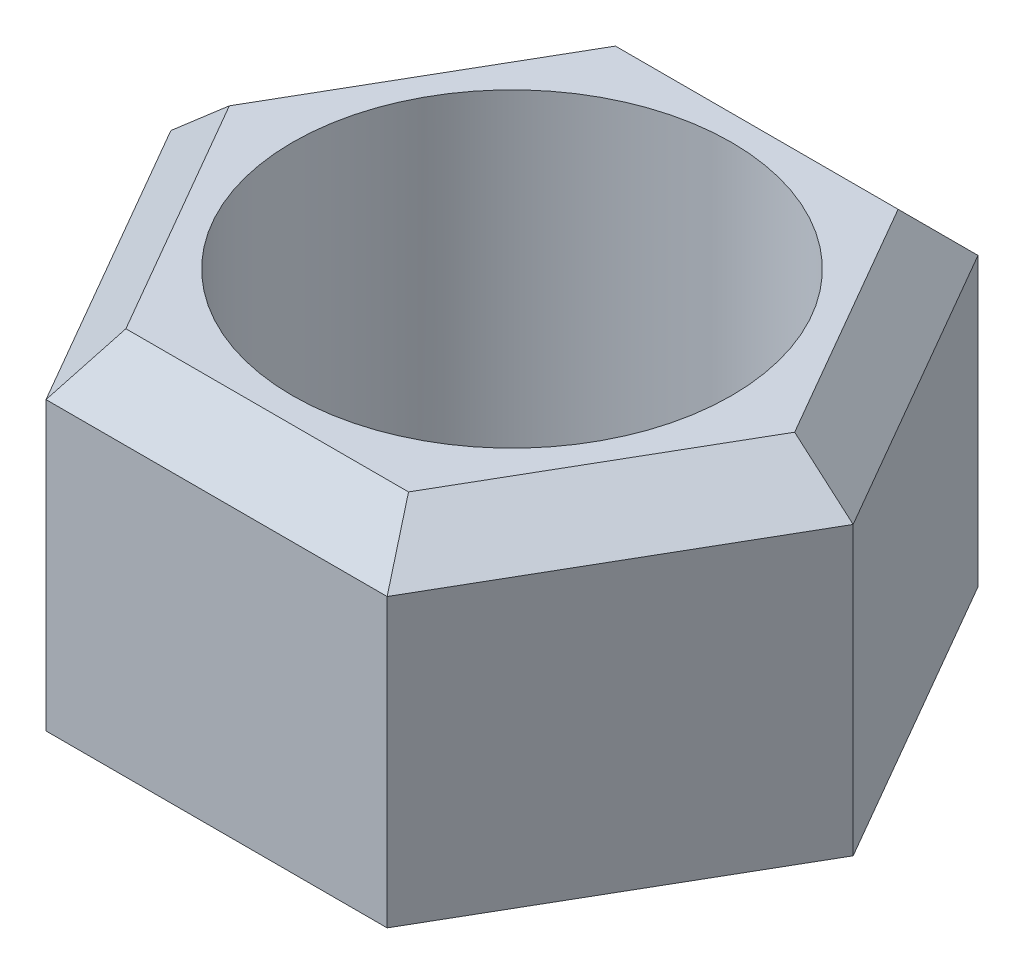
ISO-10303-21;
HEADER;
FILE_DESCRIPTION(('STEP AP214'),'2;1');
FILE_NAME('part.step','',(''),(''),'','','');
FILE_SCHEMA(('AUTOMOTIVE_DESIGN { 1 0 10303 214 1 1 1 1 }'));
ENDSEC;
DATA;
#1=APPLICATION_CONTEXT('core data for automotive mechanical design processes');
#2=APPLICATION_PROTOCOL_DEFINITION('international standard','automotive_design',2000,#1);
#3=PRODUCT_CONTEXT('',#1,'mechanical');
#4=PRODUCT('Part','Part','',(#3));
#5=PRODUCT_RELATED_PRODUCT_CATEGORY('part','',(#4));
#6=PRODUCT_DEFINITION_FORMATION('','',#4);
#7=PRODUCT_DEFINITION_CONTEXT('part definition',#1,'design');
#8=PRODUCT_DEFINITION('design','',#6,#7);
#9=PRODUCT_DEFINITION_SHAPE('','',#8);
#10=(LENGTH_UNIT() NAMED_UNIT(*) SI_UNIT(.MILLI.,.METRE.));
#11=(NAMED_UNIT(*) PLANE_ANGLE_UNIT() SI_UNIT($,.RADIAN.));
#12=(NAMED_UNIT(*) SI_UNIT($,.STERADIAN.) SOLID_ANGLE_UNIT());
#13=UNCERTAINTY_MEASURE_WITH_UNIT(LENGTH_MEASURE(1.E-05),#10,'distance_accuracy_value','');
#14=(GEOMETRIC_REPRESENTATION_CONTEXT(3) GLOBAL_UNCERTAINTY_ASSIGNED_CONTEXT((#13)) GLOBAL_UNIT_ASSIGNED_CONTEXT((#10,
#11,#12)) REPRESENTATION_CONTEXT('',''));
#15=CARTESIAN_POINT('',(0.,0.,0.));
#16=DIRECTION('',(0.,0.,1.));
#17=DIRECTION('',(1.,0.,0.));
#18=AXIS2_PLACEMENT_3D('',#15,#16,#17);
#19=CARTESIAN_POINT('',(0.202072594216369,0.2,0.));
#20=DIRECTION('',(-0.866025403784438,0.,0.5));
#21=DIRECTION('',(0.5,0.,0.866025403784439));
#22=AXIS2_PLACEMENT_3D('',#19,#20,#21);
#23=PLANE('',#22);
#24=DIRECTION('',(0.,-1.,0.));
#25=VECTOR('',#24,1.);
#26=CARTESIAN_POINT('',(0.101036297108184,0.2,-0.175));
#27=LINE('',#26,#25);
#28=CARTESIAN_POINT('',(0.101036297108184,0.17,-0.175));
#29=VERTEX_POINT('',#28);
#30=CARTESIAN_POINT('',(0.101036297108184,0.,-0.175));
#31=VERTEX_POINT('',#30);
#32=EDGE_CURVE('E110',#29,#31,#27,.T.);
#33=ORIENTED_EDGE('',*,*,#32,.F.);
#34=DIRECTION('',(0.5,0.,0.866025403784439));
#35=VECTOR('',#34,1.);
#36=CARTESIAN_POINT('',(0.202072594216369,0.17,0.));
#37=LINE('',#36,#35);
#38=CARTESIAN_POINT('',(0.202072594216369,0.17,0.));
#39=VERTEX_POINT('',#38);
#40=EDGE_CURVE('E11',#29,#39,#37,.T.);
#41=ORIENTED_EDGE('',*,*,#40,.T.);
#42=DIRECTION('',(0.,-1.,0.));
#43=VECTOR('',#42,1.);
#44=CARTESIAN_POINT('',(0.202072594216369,0.2,0.));
#45=LINE('',#44,#43);
#46=CARTESIAN_POINT('',(0.202072594216369,0.,0.));
#47=VERTEX_POINT('',#46);
#48=EDGE_CURVE('E131',#39,#47,#45,.T.);
#49=ORIENTED_EDGE('',*,*,#48,.T.);
#50=DIRECTION('',(-0.5,0.,-0.866025403784438));
#51=VECTOR('',#50,1.);
#52=CARTESIAN_POINT('',(0.202072594216369,0.,0.));
#53=LINE('',#52,#51);
#54=EDGE_CURVE('E125',#47,#31,#53,.T.);
#55=ORIENTED_EDGE('',*,*,#54,.T.);
#56=EDGE_LOOP('',(#33,#41,#49,#55));
#57=FACE_BOUND('',#56,.T.);
#58=ADVANCED_FACE('F39',(#57),#23,.F.);
#59=CARTESIAN_POINT('',(0.101036297108184,0.2,-0.175));
#60=DIRECTION('',(0.,0.,1.));
#61=DIRECTION('',(1.,0.,0.));
#62=AXIS2_PLACEMENT_3D('',#59,#60,#61);
#63=PLANE('',#62);
#64=DIRECTION('',(0.,-1.,0.));
#65=VECTOR('',#64,1.);
#66=CARTESIAN_POINT('',(-0.101036297108184,0.2,-0.175));
#67=LINE('',#66,#65);
#68=CARTESIAN_POINT('',(-0.101036297108184,0.17,-0.175));
#69=VERTEX_POINT('',#68);
#70=CARTESIAN_POINT('',(-0.101036297108184,0.,-0.175));
#71=VERTEX_POINT('',#70);
#72=EDGE_CURVE('E119',#69,#71,#67,.T.);
#73=ORIENTED_EDGE('',*,*,#72,.F.);
#74=DIRECTION('',(1.,0.,0.));
#75=VECTOR('',#74,1.);
#76=CARTESIAN_POINT('',(0.101036297108184,0.17,-0.175));
#77=LINE('',#76,#75);
#78=EDGE_CURVE('E49',#69,#29,#77,.T.);
#79=ORIENTED_EDGE('',*,*,#78,.T.);
#80=ORIENTED_EDGE('',*,*,#32,.T.);
#81=DIRECTION('',(-1.,0.,0.));
#82=VECTOR('',#81,1.);
#83=CARTESIAN_POINT('',(0.101036297108184,0.,-0.175));
#84=LINE('',#83,#82);
#85=EDGE_CURVE('E113',#31,#71,#84,.T.);
#86=ORIENTED_EDGE('',*,*,#85,.T.);
#87=EDGE_LOOP('',(#73,#79,#80,#86));
#88=FACE_BOUND('',#87,.T.);
#89=ADVANCED_FACE('F112',(#88),#63,.F.);
#90=CARTESIAN_POINT('',(-0.101036297108184,0.2,-0.175));
#91=DIRECTION('',(0.866025403784439,0.,0.5));
#92=DIRECTION('',(0.5,0.,-0.866025403784439));
#93=AXIS2_PLACEMENT_3D('',#90,#91,#92);
#94=PLANE('',#93);
#95=DIRECTION('',(0.,-1.,0.));
#96=VECTOR('',#95,1.);
#97=CARTESIAN_POINT('',(-0.202072594216369,0.2,0.));
#98=LINE('',#97,#96);
#99=CARTESIAN_POINT('',(-0.202072594216369,0.17,0.));
#100=VERTEX_POINT('',#99);
#101=CARTESIAN_POINT('',(-0.202072594216369,0.,0.));
#102=VERTEX_POINT('',#101);
#103=EDGE_CURVE('E154',#100,#102,#98,.T.);
#104=ORIENTED_EDGE('',*,*,#103,.F.);
#105=DIRECTION('',(0.5,0.,-0.866025403784439));
#106=VECTOR('',#105,1.);
#107=CARTESIAN_POINT('',(-0.101036297108184,0.17,-0.175));
#108=LINE('',#107,#106);
#109=EDGE_CURVE('E64',#100,#69,#108,.T.);
#110=ORIENTED_EDGE('',*,*,#109,.T.);
#111=ORIENTED_EDGE('',*,*,#72,.T.);
#112=DIRECTION('',(-0.5,0.,0.866025403784439));
#113=VECTOR('',#112,1.);
#114=CARTESIAN_POINT('',(-0.101036297108184,0.,-0.175));
#115=LINE('',#114,#113);
#116=EDGE_CURVE('E128',#71,#102,#115,.T.);
#117=ORIENTED_EDGE('',*,*,#116,.T.);
#118=EDGE_LOOP('',(#104,#110,#111,#117));
#119=FACE_BOUND('',#118,.T.);
#120=ADVANCED_FACE('F222',(#119),#94,.F.);
#121=CARTESIAN_POINT('',(-0.202072594216369,0.2,0.));
#122=DIRECTION('',(0.866025403784438,0.,-0.5));
#123=DIRECTION('',(-0.5,0.,-0.866025403784439));
#124=AXIS2_PLACEMENT_3D('',#121,#122,#123);
#125=PLANE('',#124);
#126=DIRECTION('',(0.,-1.,0.));
#127=VECTOR('',#126,1.);
#128=CARTESIAN_POINT('',(-0.101036297108184,0.2,0.175));
#129=LINE('',#128,#127);
#130=CARTESIAN_POINT('',(-0.101036297108184,0.17,0.175));
#131=VERTEX_POINT('',#130);
#132=CARTESIAN_POINT('',(-0.101036297108184,0.,0.175));
#133=VERTEX_POINT('',#132);
#134=EDGE_CURVE('E152',#131,#133,#129,.T.);
#135=ORIENTED_EDGE('',*,*,#134,.F.);
#136=DIRECTION('',(-0.5,0.,-0.866025403784439));
#137=VECTOR('',#136,1.);
#138=CARTESIAN_POINT('',(-0.202072594216369,0.17,0.));
#139=LINE('',#138,#137);
#140=EDGE_CURVE('E174',#131,#100,#139,.T.);
#141=ORIENTED_EDGE('',*,*,#140,.T.);
#142=ORIENTED_EDGE('',*,*,#103,.T.);
#143=DIRECTION('',(0.5,0.,0.866025403784439));
#144=VECTOR('',#143,1.);
#145=CARTESIAN_POINT('',(-0.202072594216369,0.,0.));
#146=LINE('',#145,#144);
#147=EDGE_CURVE('E141',#102,#133,#146,.T.);
#148=ORIENTED_EDGE('',*,*,#147,.T.);
#149=EDGE_LOOP('',(#135,#141,#142,#148));
#150=FACE_BOUND('',#149,.T.);
#151=ADVANCED_FACE('F279',(#150),#125,.F.);
#152=CARTESIAN_POINT('',(-0.101036297108184,0.2,0.175));
#153=DIRECTION('',(0.,0.,-1.));
#154=DIRECTION('',(-1.,0.,0.));
#155=AXIS2_PLACEMENT_3D('',#152,#153,#154);
#156=PLANE('',#155);
#157=DIRECTION('',(0.,-1.,0.));
#158=VECTOR('',#157,1.);
#159=CARTESIAN_POINT('',(0.101036297108185,0.2,0.175));
#160=LINE('',#159,#158);
#161=CARTESIAN_POINT('',(0.101036297108185,0.17,0.175));
#162=VERTEX_POINT('',#161);
#163=CARTESIAN_POINT('',(0.101036297108185,0.,0.175));
#164=VERTEX_POINT('',#163);
#165=EDGE_CURVE('E150',#162,#164,#160,.T.);
#166=ORIENTED_EDGE('',*,*,#165,.F.);
#167=DIRECTION('',(-1.,0.,0.));
#168=VECTOR('',#167,1.);
#169=CARTESIAN_POINT('',(-0.101036297108184,0.17,0.175));
#170=LINE('',#169,#168);
#171=EDGE_CURVE('E172',#162,#131,#170,.T.);
#172=ORIENTED_EDGE('',*,*,#171,.T.);
#173=ORIENTED_EDGE('',*,*,#134,.T.);
#174=DIRECTION('',(1.,0.,0.));
#175=VECTOR('',#174,1.);
#176=CARTESIAN_POINT('',(-0.101036297108184,0.,0.175));
#177=LINE('',#176,#175);
#178=EDGE_CURVE('E144',#133,#164,#177,.T.);
#179=ORIENTED_EDGE('',*,*,#178,.T.);
#180=EDGE_LOOP('',(#166,#172,#173,#179));
#181=FACE_BOUND('',#180,.T.);
#182=ADVANCED_FACE('F277',(#181),#156,.F.);
#183=CARTESIAN_POINT('',(0.101036297108185,0.2,0.175));
#184=DIRECTION('',(-0.866025403784439,0.,-0.5));
#185=DIRECTION('',(-0.5,0.,0.866025403784439));
#186=AXIS2_PLACEMENT_3D('',#183,#184,#185);
#187=PLANE('',#186);
#188=ORIENTED_EDGE('',*,*,#48,.F.);
#189=DIRECTION('',(-0.5,0.,0.866025403784439));
#190=VECTOR('',#189,1.);
#191=CARTESIAN_POINT('',(0.101036297108185,0.17,0.175));
#192=LINE('',#191,#190);
#193=EDGE_CURVE('E169',#39,#162,#192,.T.);
#194=ORIENTED_EDGE('',*,*,#193,.T.);
#195=ORIENTED_EDGE('',*,*,#165,.T.);
#196=DIRECTION('',(0.5,0.,-0.866025403784439));
#197=VECTOR('',#196,1.);
#198=CARTESIAN_POINT('',(0.101036297108185,0.,0.175));
#199=LINE('',#198,#197);
#200=EDGE_CURVE('E147',#164,#47,#199,.T.);
#201=ORIENTED_EDGE('',*,*,#200,.T.);
#202=EDGE_LOOP('',(#188,#194,#195,#201));
#203=FACE_BOUND('',#202,.T.);
#204=ADVANCED_FACE('F213',(#203),#187,.F.);
#205=CARTESIAN_POINT('',(0.,0.2,0.));
#206=DIRECTION('',(0.,1.,0.));
#207=DIRECTION('',(0.,0.,1.));
#208=AXIS2_PLACEMENT_3D('',#205,#206,#207);
#209=PLANE('',#208);
#210=DIRECTION('',(1.,0.,0.));
#211=VECTOR('',#210,1.);
#212=CARTESIAN_POINT('',(0.101036297108185,0.2,0.145));
#213=LINE('',#212,#211);
#214=CARTESIAN_POINT('',(-0.0837157890324957,0.2,0.145));
#215=VERTEX_POINT('',#214);
#216=CARTESIAN_POINT('',(0.0837157890324958,0.2,0.145));
#217=VERTEX_POINT('',#216);
#218=EDGE_CURVE('E164',#215,#217,#213,.T.);
#219=ORIENTED_EDGE('',*,*,#218,.T.);
#220=DIRECTION('',(0.5,0.,-0.866025403784439));
#221=VECTOR('',#220,1.);
#222=CARTESIAN_POINT('',(0.176091832102836,0.2,-0.015));
#223=LINE('',#222,#221);
#224=CARTESIAN_POINT('',(0.167431578064992,0.2,0.));
#225=VERTEX_POINT('',#224);
#226=EDGE_CURVE('E166',#217,#225,#223,.T.);
#227=ORIENTED_EDGE('',*,*,#226,.T.);
#228=DIRECTION('',(-0.5,0.,-0.866025403784439));
#229=VECTOR('',#228,1.);
#230=CARTESIAN_POINT('',(0.0750555349946514,0.2,-0.16));
#231=LINE('',#230,#229);
#232=CARTESIAN_POINT('',(0.0837157890324958,0.2,-0.145));
#233=VERTEX_POINT('',#232);
#234=EDGE_CURVE('E118',#225,#233,#231,.T.);
#235=ORIENTED_EDGE('',*,*,#234,.T.);
#236=DIRECTION('',(-1.,0.,0.));
#237=VECTOR('',#236,1.);
#238=CARTESIAN_POINT('',(-0.101036297108184,0.2,-0.145));
#239=LINE('',#238,#237);
#240=CARTESIAN_POINT('',(-0.0837157890324958,0.2,-0.145));
#241=VERTEX_POINT('',#240);
#242=EDGE_CURVE('E158',#233,#241,#239,.T.);
#243=ORIENTED_EDGE('',*,*,#242,.T.);
#244=DIRECTION('',(-0.5,0.,0.866025403784439));
#245=VECTOR('',#244,1.);
#246=CARTESIAN_POINT('',(-0.176091832102836,0.2,0.015));
#247=LINE('',#246,#245);
#248=CARTESIAN_POINT('',(-0.167431578064992,0.2,0.));
#249=VERTEX_POINT('',#248);
#250=EDGE_CURVE('E160',#241,#249,#247,.T.);
#251=ORIENTED_EDGE('',*,*,#250,.T.);
#252=DIRECTION('',(0.5,0.,0.866025403784439));
#253=VECTOR('',#252,1.);
#254=CARTESIAN_POINT('',(-0.0750555349946513,0.2,0.16));
#255=LINE('',#254,#253);
#256=EDGE_CURVE('E162',#249,#215,#255,.T.);
#257=ORIENTED_EDGE('',*,*,#256,.T.);
#258=EDGE_LOOP('',(#219,#227,#235,#243,#251,#257));
#259=FACE_BOUND('',#258,.T.);
#260=CARTESIAN_POINT('',(0.,0.2,0.));
#261=DIRECTION('',(0.,1.,0.));
#262=DIRECTION('',(0.,0.,1.));
#263=AXIS2_PLACEMENT_3D('',#260,#261,#262);
#264=CIRCLE('',#263,0.13);
#265=CARTESIAN_POINT('',(0.,0.2,0.13));
#266=VERTEX_POINT('',#265);
#267=EDGE_CURVE('E136',#266,#266,#264,.F.);
#268=ORIENTED_EDGE('',*,*,#267,.T.);
#269=EDGE_LOOP('',(#268));
#270=FACE_BOUND('',#269,.T.);
#271=ADVANCED_FACE('F200',(#259,#270),#209,.T.);
#272=CARTESIAN_POINT('',(0.,0.,0.));
#273=DIRECTION('',(0.,1.,0.));
#274=DIRECTION('',(0.,0.,1.));
#275=AXIS2_PLACEMENT_3D('',#272,#273,#274);
#276=PLANE('',#275);
#277=CARTESIAN_POINT('',(0.,0.,0.));
#278=DIRECTION('',(0.,-1.,0.));
#279=DIRECTION('',(0.,0.,-1.));
#280=AXIS2_PLACEMENT_3D('',#277,#278,#279);
#281=CIRCLE('',#280,0.13);
#282=CARTESIAN_POINT('',(0.,0.,-0.13));
#283=VERTEX_POINT('',#282);
#284=EDGE_CURVE('E133',#283,#283,#281,.T.);
#285=ORIENTED_EDGE('',*,*,#284,.F.);
#286=EDGE_LOOP('',(#285));
#287=FACE_BOUND('',#286,.T.);
#288=ORIENTED_EDGE('',*,*,#54,.F.);
#289=ORIENTED_EDGE('',*,*,#200,.F.);
#290=ORIENTED_EDGE('',*,*,#178,.F.);
#291=ORIENTED_EDGE('',*,*,#147,.F.);
#292=ORIENTED_EDGE('',*,*,#116,.F.);
#293=ORIENTED_EDGE('',*,*,#85,.F.);
#294=EDGE_LOOP('',(#288,#289,#290,#291,#292,#293));
#295=FACE_BOUND('',#294,.T.);
#296=ADVANCED_FACE('F123',(#287,#295),#276,.F.);
#297=CARTESIAN_POINT('',(0.,0.201,0.));
#298=DIRECTION('',(0.,-1.,0.));
#299=DIRECTION('',(0.,0.,-1.));
#300=AXIS2_PLACEMENT_3D('',#297,#298,#299);
#301=CYLINDRICAL_SURFACE('',#300,0.13);
#302=ORIENTED_EDGE('',*,*,#267,.F.);
#303=EDGE_LOOP('',(#302));
#304=FACE_BOUND('',#303,.T.);
#305=ORIENTED_EDGE('',*,*,#284,.T.);
#306=EDGE_LOOP('',(#305));
#307=FACE_BOUND('',#306,.T.);
#308=ADVANCED_FACE('F202',(#304,#307),#301,.F.);
#309=CARTESIAN_POINT('',(-0.125573683548744,0.2,-0.0725));
#310=DIRECTION('',(-0.612372435695795,0.707106781186547,-0.353553390593274));
#311=DIRECTION('',(0.5,0.,-0.866025403784439));
#312=AXIS2_PLACEMENT_3D('',#309,#310,#311);
#313=PLANE('',#312);
#314=DIRECTION('',(0.377964473009227,0.654653670707978,0.654653670707976));
#315=VECTOR('',#314,1.);
#316=CARTESIAN_POINT('',(-0.0717563905992821,0.220714285714286,-0.124285714285714));
#317=LINE('',#316,#315);
#318=EDGE_CURVE('E187',#69,#241,#317,.T.);
#319=ORIENTED_EDGE('',*,*,#318,.F.);
#320=ORIENTED_EDGE('',*,*,#109,.F.);
#321=DIRECTION('',(0.755928946018454,0.654653670707978,0.));
#322=VECTOR('',#321,1.);
#323=CARTESIAN_POINT('',(-0.143512781198564,0.220714285714286,0.));
#324=LINE('',#323,#322);
#325=EDGE_CURVE('E44',#249,#100,#324,.F.);
#326=ORIENTED_EDGE('',*,*,#325,.F.);
#327=ORIENTED_EDGE('',*,*,#250,.F.);
#328=EDGE_LOOP('',(#319,#320,#326,#327));
#329=FACE_BOUND('',#328,.T.);
#330=ADVANCED_FACE('F42',(#329),#313,.T.);
#331=CARTESIAN_POINT('',(-0.125573683548744,0.2,0.0725000000000001));
#332=DIRECTION('',(-0.612372435695795,0.707106781186547,0.353553390593274));
#333=DIRECTION('',(-0.5,0.,-0.866025403784439));
#334=AXIS2_PLACEMENT_3D('',#331,#332,#333);
#335=PLANE('',#334);
#336=ORIENTED_EDGE('',*,*,#325,.T.);
#337=ORIENTED_EDGE('',*,*,#140,.F.);
#338=DIRECTION('',(0.377964473009227,0.654653670707978,-0.654653670707977));
#339=VECTOR('',#338,1.);
#340=CARTESIAN_POINT('',(-0.071756390599282,0.220714285714286,0.124285714285715));
#341=LINE('',#340,#339);
#342=EDGE_CURVE('E185',#215,#131,#341,.F.);
#343=ORIENTED_EDGE('',*,*,#342,.F.);
#344=ORIENTED_EDGE('',*,*,#256,.F.);
#345=EDGE_LOOP('',(#336,#337,#343,#344));
#346=FACE_BOUND('',#345,.T.);
#347=ADVANCED_FACE('F253',(#346),#335,.T.);
#348=CARTESIAN_POINT('',(0.,0.2,-0.145));
#349=DIRECTION('',(0.,0.707106781186546,-0.707106781186548));
#350=DIRECTION('',(1.,0.,0.));
#351=AXIS2_PLACEMENT_3D('',#348,#349,#350);
#352=PLANE('',#351);
#353=ORIENTED_EDGE('',*,*,#318,.T.);
#354=ORIENTED_EDGE('',*,*,#242,.F.);
#355=DIRECTION('',(-0.377964473009227,0.654653670707978,0.654653670707976));
#356=VECTOR('',#355,1.);
#357=CARTESIAN_POINT('',(0.0717563905992821,0.220714285714286,-0.124285714285714));
#358=LINE('',#357,#356);
#359=EDGE_CURVE('E182',#29,#233,#358,.T.);
#360=ORIENTED_EDGE('',*,*,#359,.F.);
#361=ORIENTED_EDGE('',*,*,#78,.F.);
#362=EDGE_LOOP('',(#353,#354,#360,#361));
#363=FACE_BOUND('',#362,.T.);
#364=ADVANCED_FACE('F247',(#363),#352,.T.);
#365=CARTESIAN_POINT('',(0.,0.2,0.145));
#366=DIRECTION('',(0.,0.707106781186546,0.707106781186548));
#367=DIRECTION('',(-1.,0.,0.));
#368=AXIS2_PLACEMENT_3D('',#365,#366,#367);
#369=PLANE('',#368);
#370=ORIENTED_EDGE('',*,*,#342,.T.);
#371=ORIENTED_EDGE('',*,*,#171,.F.);
#372=DIRECTION('',(-0.377964473009228,0.654653670707978,-0.654653670707976));
#373=VECTOR('',#372,1.);
#374=CARTESIAN_POINT('',(0.0717563905992821,0.220714285714286,0.124285714285714));
#375=LINE('',#374,#373);
#376=EDGE_CURVE('E180',#217,#162,#375,.F.);
#377=ORIENTED_EDGE('',*,*,#376,.F.);
#378=ORIENTED_EDGE('',*,*,#218,.F.);
#379=EDGE_LOOP('',(#370,#371,#377,#378));
#380=FACE_BOUND('',#379,.T.);
#381=ADVANCED_FACE('F240',(#380),#369,.T.);
#382=CARTESIAN_POINT('',(0.125573683548744,0.2,-0.0725000000000001));
#383=DIRECTION('',(0.612372435695795,0.707106781186547,-0.353553390593274));
#384=DIRECTION('',(0.5,0.,0.866025403784439));
#385=AXIS2_PLACEMENT_3D('',#382,#383,#384);
#386=PLANE('',#385);
#387=ORIENTED_EDGE('',*,*,#359,.T.);
#388=ORIENTED_EDGE('',*,*,#234,.F.);
#389=DIRECTION('',(0.755928946018454,-0.654653670707978,0.));
#390=VECTOR('',#389,1.);
#391=CARTESIAN_POINT('',(0.143512781198564,0.220714285714286,0.));
#392=LINE('',#391,#390);
#393=EDGE_CURVE('E178',#39,#225,#392,.F.);
#394=ORIENTED_EDGE('',*,*,#393,.F.);
#395=ORIENTED_EDGE('',*,*,#40,.F.);
#396=EDGE_LOOP('',(#387,#388,#394,#395));
#397=FACE_BOUND('',#396,.T.);
#398=ADVANCED_FACE('F233',(#397),#386,.T.);
#399=CARTESIAN_POINT('',(0.125573683548744,0.2,0.0725));
#400=DIRECTION('',(0.612372435695795,0.707106781186547,0.353553390593274));
#401=DIRECTION('',(-0.5,0.,0.866025403784439));
#402=AXIS2_PLACEMENT_3D('',#399,#400,#401);
#403=PLANE('',#402);
#404=ORIENTED_EDGE('',*,*,#376,.T.);
#405=ORIENTED_EDGE('',*,*,#193,.F.);
#406=ORIENTED_EDGE('',*,*,#393,.T.);
#407=ORIENTED_EDGE('',*,*,#226,.F.);
#408=EDGE_LOOP('',(#404,#405,#406,#407));
#409=FACE_BOUND('',#408,.T.);
#410=ADVANCED_FACE('F227',(#409),#403,.T.);
#411=CLOSED_SHELL('',(#58,#89,#120,#151,#182,#204,#271,#296,#308,#330,#347,#364,#381,#398,#410));
#412=MANIFOLD_SOLID_BREP('B2',#411);
#413=ADVANCED_BREP_SHAPE_REPRESENTATION('',(#18,#412),#14);
#414=SHAPE_DEFINITION_REPRESENTATION(#9,#413);
ENDSEC;
END-ISO-10303-21;
